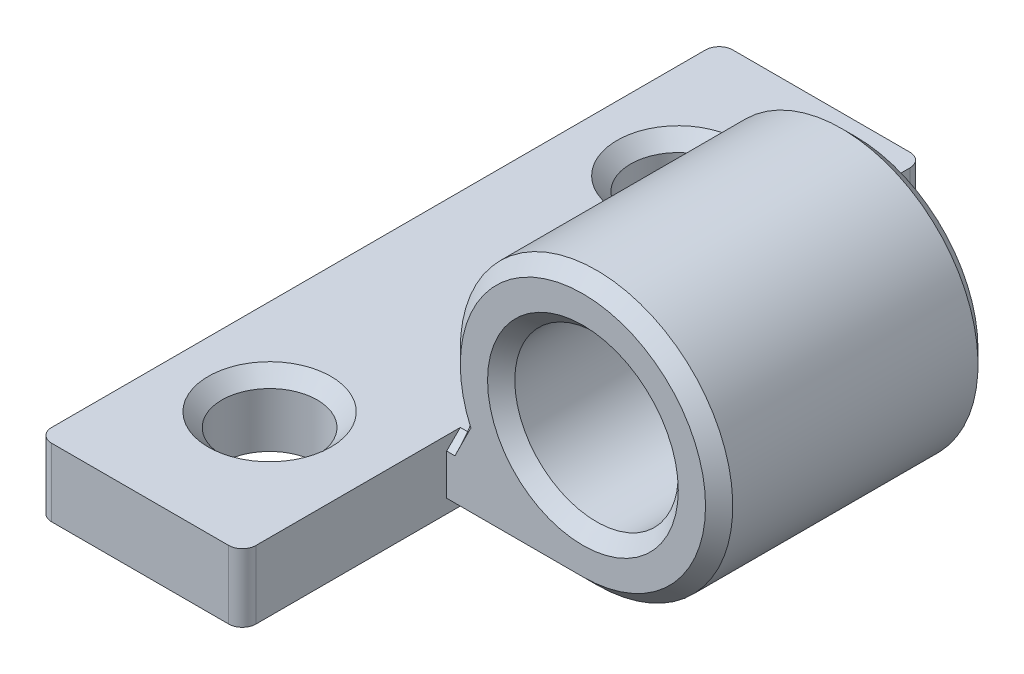
ISO-10303-21;
HEADER;
FILE_DESCRIPTION(('STEP AP214'),'2;1');
FILE_NAME('part.step','',(''),(''),'','','');
FILE_SCHEMA(('AUTOMOTIVE_DESIGN { 1 0 10303 214 1 1 1 1 }'));
ENDSEC;
DATA;
#1=APPLICATION_CONTEXT('core data for automotive mechanical design processes');
#2=APPLICATION_PROTOCOL_DEFINITION('international standard','automotive_design',2000,#1);
#3=PRODUCT_CONTEXT('',#1,'mechanical');
#4=PRODUCT('Part','Part','',(#3));
#5=PRODUCT_RELATED_PRODUCT_CATEGORY('part','',(#4));
#6=PRODUCT_DEFINITION_FORMATION('','',#4);
#7=PRODUCT_DEFINITION_CONTEXT('part definition',#1,'design');
#8=PRODUCT_DEFINITION('design','',#6,#7);
#9=PRODUCT_DEFINITION_SHAPE('','',#8);
#10=(LENGTH_UNIT() NAMED_UNIT(*) SI_UNIT(.MILLI.,.METRE.));
#11=(NAMED_UNIT(*) PLANE_ANGLE_UNIT() SI_UNIT($,.RADIAN.));
#12=(NAMED_UNIT(*) SI_UNIT($,.STERADIAN.) SOLID_ANGLE_UNIT());
#13=UNCERTAINTY_MEASURE_WITH_UNIT(LENGTH_MEASURE(1.E-05),#10,'distance_accuracy_value','');
#14=(GEOMETRIC_REPRESENTATION_CONTEXT(3) GLOBAL_UNCERTAINTY_ASSIGNED_CONTEXT((#13)) GLOBAL_UNIT_ASSIGNED_CONTEXT((#10,
#11,#12)) REPRESENTATION_CONTEXT('',''));
#15=CARTESIAN_POINT('',(0.,0.,0.));
#16=DIRECTION('',(0.,0.,1.));
#17=DIRECTION('',(1.,0.,0.));
#18=AXIS2_PLACEMENT_3D('',#15,#16,#17);
#19=CARTESIAN_POINT('',(-4.65512218419229,-5.89025206734602,34.375));
#20=DIRECTION('',(0.,0.,-1.));
#21=DIRECTION('',(-1.,0.,0.));
#22=AXIS2_PLACEMENT_3D('',#19,#20,#21);
#23=CYLINDRICAL_SURFACE('',#22,3.75);
#24=DIRECTION('',(0.,0.,-1.));
#25=VECTOR('',#24,1.);
#26=CARTESIAN_POINT('',(-4.65512218419229,-9.64025206734602,34.375));
#27=LINE('',#26,#25);
#28=CARTESIAN_POINT('',(-4.65512218419229,-9.64025206734602,28.375));
#29=VERTEX_POINT('',#28);
#30=CARTESIAN_POINT('',(-4.65512218419229,-9.64025206734602,21.625));
#31=VERTEX_POINT('',#30);
#32=EDGE_CURVE('E336',#29,#31,#27,.T.);
#33=ORIENTED_EDGE('',*,*,#32,.T.);
#34=CARTESIAN_POINT('',(-4.65512218419229,-5.89025206734602,21.625));
#35=DIRECTION('',(0.,0.,1.));
#36=DIRECTION('',(1.,0.,0.));
#37=AXIS2_PLACEMENT_3D('',#34,#35,#36);
#38=CIRCLE('',#37,3.75);
#39=CARTESIAN_POINT('',(-8.0825442577188,-7.41185580350838,21.625));
#40=VERTEX_POINT('',#39);
#41=EDGE_CURVE('E231',#31,#40,#38,.T.);
#42=ORIENTED_EDGE('',*,*,#41,.T.);
#43=DIRECTION('',(0.,0.,-1.));
#44=VECTOR('',#43,1.);
#45=CARTESIAN_POINT('',(-8.0825442577188,-7.41185580350838,34.375));
#46=LINE('',#45,#44);
#47=CARTESIAN_POINT('',(-8.0825442577188,-7.41185580350838,28.375));
#48=VERTEX_POINT('',#47);
#49=EDGE_CURVE('E227',#40,#48,#46,.F.);
#50=ORIENTED_EDGE('',*,*,#49,.T.);
#51=CARTESIAN_POINT('',(-4.65512218419229,-5.89025206734602,28.375));
#52=DIRECTION('',(0.,0.,-1.));
#53=DIRECTION('',(-1.,0.,0.));
#54=AXIS2_PLACEMENT_3D('',#51,#52,#53);
#55=CIRCLE('',#54,3.75);
#56=EDGE_CURVE('E229',#48,#29,#55,.T.);
#57=ORIENTED_EDGE('',*,*,#56,.T.);
#58=EDGE_LOOP('',(#33,#42,#50,#57));
#59=FACE_BOUND('',#58,.T.);
#60=ADVANCED_FACE('F36',(#59),#23,.T.);
#61=CARTESIAN_POINT('',(-4.65512218419229,-5.89025206734602,34.375));
#62=DIRECTION('',(0.,0.,1.));
#63=DIRECTION('',(1.,0.,0.));
#64=AXIS2_PLACEMENT_3D('',#61,#62,#63);
#65=PLANE('',#64);
#66=DIRECTION('',(-1.,0.,0.));
#67=VECTOR('',#66,1.);
#68=CARTESIAN_POINT('',(-14.0301221841923,-7.76525206734602,34.375));
#69=LINE('',#68,#67);
#70=CARTESIAN_POINT('',(-8.78012218419229,-7.76525206734602,34.375));
#71=VERTEX_POINT('',#70);
#72=CARTESIAN_POINT('',(-13.6551221841923,-7.76525206734602,34.375));
#73=VERTEX_POINT('',#72);
#74=EDGE_CURVE('E342',#71,#73,#69,.T.);
#75=ORIENTED_EDGE('',*,*,#74,.T.);
#76=DIRECTION('',(0.,-1.,0.));
#77=VECTOR('',#76,1.);
#78=CARTESIAN_POINT('',(-13.6551221841923,-9.64025206734602,34.375));
#79=LINE('',#78,#77);
#80=CARTESIAN_POINT('',(-13.6551221841923,-9.64025206734602,34.375));
#81=VERTEX_POINT('',#80);
#82=EDGE_CURVE('E44',#73,#81,#79,.T.);
#83=ORIENTED_EDGE('',*,*,#82,.T.);
#84=DIRECTION('',(1.,0.,0.));
#85=VECTOR('',#84,1.);
#86=CARTESIAN_POINT('',(-4.65512218419229,-9.64025206734602,34.375));
#87=LINE('',#86,#85);
#88=CARTESIAN_POINT('',(-8.78012218419229,-9.64025206734602,34.375));
#89=VERTEX_POINT('',#88);
#90=EDGE_CURVE('E346',#81,#89,#87,.T.);
#91=ORIENTED_EDGE('',*,*,#90,.T.);
#92=DIRECTION('',(0.,1.,0.));
#93=VECTOR('',#92,1.);
#94=CARTESIAN_POINT('',(-8.78012218419229,-7.76525206734601,34.375));
#95=LINE('',#94,#93);
#96=EDGE_CURVE('E510',#89,#71,#95,.T.);
#97=ORIENTED_EDGE('',*,*,#96,.T.);
#98=EDGE_LOOP('',(#75,#83,#91,#97));
#99=FACE_BOUND('',#98,.T.);
#100=ADVANCED_FACE('F281',(#99),#65,.T.);
#101=CARTESIAN_POINT('',(-4.65512218419229,-5.89025206734602,15.625));
#102=DIRECTION('',(0.,0.,1.));
#103=DIRECTION('',(1.,0.,0.));
#104=AXIS2_PLACEMENT_3D('',#101,#102,#103);
#105=PLANE('',#104);
#106=DIRECTION('',(-1.,0.,0.));
#107=VECTOR('',#106,1.);
#108=CARTESIAN_POINT('',(-14.0301221841923,-7.76525206734602,15.625));
#109=LINE('',#108,#107);
#110=CARTESIAN_POINT('',(-8.78012218419229,-7.76525206734602,15.625));
#111=VERTEX_POINT('',#110);
#112=CARTESIAN_POINT('',(-13.6551221841923,-7.76525206734602,15.625));
#113=VERTEX_POINT('',#112);
#114=EDGE_CURVE('E343',#111,#113,#109,.T.);
#115=ORIENTED_EDGE('',*,*,#114,.F.);
#116=DIRECTION('',(0.,1.,0.));
#117=VECTOR('',#116,1.);
#118=CARTESIAN_POINT('',(-8.78012218419229,-5.89025206734602,15.625));
#119=LINE('',#118,#117);
#120=CARTESIAN_POINT('',(-8.78012218419229,-9.64025206734602,15.625));
#121=VERTEX_POINT('',#120);
#122=EDGE_CURVE('E499',#111,#121,#119,.F.);
#123=ORIENTED_EDGE('',*,*,#122,.T.);
#124=DIRECTION('',(1.,0.,0.));
#125=VECTOR('',#124,1.);
#126=CARTESIAN_POINT('',(-4.65512218419229,-9.64025206734602,15.625));
#127=LINE('',#126,#125);
#128=CARTESIAN_POINT('',(-13.6551221841923,-9.64025206734602,15.625));
#129=VERTEX_POINT('',#128);
#130=EDGE_CURVE('E347',#129,#121,#127,.T.);
#131=ORIENTED_EDGE('',*,*,#130,.F.);
#132=DIRECTION('',(0.,-1.,0.));
#133=VECTOR('',#132,1.);
#134=CARTESIAN_POINT('',(-13.6551221841923,-5.89025206734602,15.625));
#135=LINE('',#134,#133);
#136=EDGE_CURVE('E497',#129,#113,#135,.F.);
#137=ORIENTED_EDGE('',*,*,#136,.T.);
#138=EDGE_LOOP('',(#115,#123,#131,#137));
#139=FACE_BOUND('',#138,.T.);
#140=ADVANCED_FACE('F284',(#139),#105,.F.);
#141=CARTESIAN_POINT('',(-14.0301221841923,-7.76525206734602,34.375));
#142=DIRECTION('',(1.,0.,0.));
#143=DIRECTION('',(0.,1.,0.));
#144=AXIS2_PLACEMENT_3D('',#141,#142,#143);
#145=PLANE('',#144);
#146=DIRECTION('',(0.,0.,-1.));
#147=VECTOR('',#146,1.);
#148=CARTESIAN_POINT('',(-14.0301221841923,-7.76525206734602,34.375));
#149=LINE('',#148,#147);
#150=CARTESIAN_POINT('',(-14.0301221841923,-7.76525206734602,34.));
#151=VERTEX_POINT('',#150);
#152=CARTESIAN_POINT('',(-14.0301221841923,-7.76525206734602,16.));
#153=VERTEX_POINT('',#152);
#154=EDGE_CURVE('E339',#151,#153,#149,.T.);
#155=ORIENTED_EDGE('',*,*,#154,.T.);
#156=DIRECTION('',(0.,-1.,0.));
#157=VECTOR('',#156,1.);
#158=CARTESIAN_POINT('',(-14.0301221841923,-7.76525206734602,16.));
#159=LINE('',#158,#157);
#160=CARTESIAN_POINT('',(-14.0301221841923,-9.64025206734602,16.));
#161=VERTEX_POINT('',#160);
#162=EDGE_CURVE('E508',#153,#161,#159,.T.);
#163=ORIENTED_EDGE('',*,*,#162,.T.);
#164=DIRECTION('',(0.,0.,-1.));
#165=VECTOR('',#164,1.);
#166=CARTESIAN_POINT('',(-14.0301221841923,-9.64025206734602,34.375));
#167=LINE('',#166,#165);
#168=CARTESIAN_POINT('',(-14.0301221841923,-9.64025206734602,34.));
#169=VERTEX_POINT('',#168);
#170=EDGE_CURVE('E334',#169,#161,#167,.T.);
#171=ORIENTED_EDGE('',*,*,#170,.F.);
#172=DIRECTION('',(0.,-1.,0.));
#173=VECTOR('',#172,1.);
#174=CARTESIAN_POINT('',(-14.0301221841923,-7.76525206734602,34.));
#175=LINE('',#174,#173);
#176=EDGE_CURVE('E483',#169,#151,#175,.F.);
#177=ORIENTED_EDGE('',*,*,#176,.T.);
#178=EDGE_LOOP('',(#155,#163,#171,#177));
#179=FACE_BOUND('',#178,.T.);
#180=ADVANCED_FACE('F288',(#179),#145,.F.);
#181=CARTESIAN_POINT('',(-4.65512218419229,-9.64025206734602,34.375));
#182=DIRECTION('',(0.,1.,0.));
#183=DIRECTION('',(-1.,0.,0.));
#184=AXIS2_PLACEMENT_3D('',#181,#182,#183);
#185=PLANE('',#184);
#186=CARTESIAN_POINT('',(-11.4051221841923,-9.64025206734602,19.375));
#187=DIRECTION('',(0.,1.,0.));
#188=DIRECTION('',(-1.,0.,0.));
#189=AXIS2_PLACEMENT_3D('',#186,#187,#188);
#190=CIRCLE('',#189,1.3125);
#191=CARTESIAN_POINT('',(-12.7176221841923,-9.64025206734602,19.375));
#192=VERTEX_POINT('',#191);
#193=EDGE_CURVE('E350',#192,#192,#190,.T.);
#194=ORIENTED_EDGE('',*,*,#193,.T.);
#195=EDGE_LOOP('',(#194));
#196=FACE_BOUND('',#195,.T.);
#197=CARTESIAN_POINT('',(-11.4051221841923,-9.64025206734602,30.625));
#198=DIRECTION('',(0.,1.,0.));
#199=DIRECTION('',(-1.,0.,0.));
#200=AXIS2_PLACEMENT_3D('',#197,#198,#199);
#201=CIRCLE('',#200,1.3125);
#202=CARTESIAN_POINT('',(-12.7176221841923,-9.64025206734602,30.625));
#203=VERTEX_POINT('',#202);
#204=EDGE_CURVE('E357',#203,#203,#201,.T.);
#205=ORIENTED_EDGE('',*,*,#204,.T.);
#206=EDGE_LOOP('',(#205));
#207=FACE_BOUND('',#206,.T.);
#208=ORIENTED_EDGE('',*,*,#130,.T.);
#209=CARTESIAN_POINT('',(-8.78012218419229,-9.64025206734602,16.));
#210=DIRECTION('',(0.,1.,0.));
#211=DIRECTION('',(-1.,0.,0.));
#212=AXIS2_PLACEMENT_3D('',#209,#210,#211);
#213=CIRCLE('',#212,0.375);
#214=CARTESIAN_POINT('',(-8.40512218419229,-9.64025206734602,16.));
#215=VERTEX_POINT('',#214);
#216=EDGE_CURVE('E505',#121,#215,#213,.F.);
#217=ORIENTED_EDGE('',*,*,#216,.T.);
#218=DIRECTION('',(0.,0.,1.));
#219=VECTOR('',#218,1.);
#220=CARTESIAN_POINT('',(-8.40512218419229,-9.64025206734602,34.375));
#221=LINE('',#220,#219);
#222=CARTESIAN_POINT('',(-8.40512218419229,-9.64025206734602,21.625));
#223=VERTEX_POINT('',#222);
#224=EDGE_CURVE('E360',#215,#223,#221,.T.);
#225=ORIENTED_EDGE('',*,*,#224,.T.);
#226=DIRECTION('',(1.,0.,0.));
#227=VECTOR('',#226,1.);
#228=CARTESIAN_POINT('',(-4.65512218419229,-9.64025206734602,21.625));
#229=LINE('',#228,#227);
#230=EDGE_CURVE('E217',#223,#31,#229,.T.);
#231=ORIENTED_EDGE('',*,*,#230,.T.);
#232=ORIENTED_EDGE('',*,*,#32,.F.);
#233=DIRECTION('',(-1.,0.,0.));
#234=VECTOR('',#233,1.);
#235=CARTESIAN_POINT('',(-4.65512218419229,-9.64025206734602,28.375));
#236=LINE('',#235,#234);
#237=CARTESIAN_POINT('',(-8.40512218419229,-9.64025206734602,28.375));
#238=VERTEX_POINT('',#237);
#239=EDGE_CURVE('E215',#29,#238,#236,.T.);
#240=ORIENTED_EDGE('',*,*,#239,.T.);
#241=DIRECTION('',(0.,0.,1.));
#242=VECTOR('',#241,1.);
#243=CARTESIAN_POINT('',(-8.40512218419229,-9.64025206734602,34.375));
#244=LINE('',#243,#242);
#245=CARTESIAN_POINT('',(-8.40512218419229,-9.64025206734602,34.));
#246=VERTEX_POINT('',#245);
#247=EDGE_CURVE('E170',#238,#246,#244,.T.);
#248=ORIENTED_EDGE('',*,*,#247,.T.);
#249=CARTESIAN_POINT('',(-8.78012218419229,-9.64025206734602,34.));
#250=DIRECTION('',(0.,1.,0.));
#251=DIRECTION('',(-1.,0.,0.));
#252=AXIS2_PLACEMENT_3D('',#249,#250,#251);
#253=CIRCLE('',#252,0.375);
#254=EDGE_CURVE('E501',#246,#89,#253,.F.);
#255=ORIENTED_EDGE('',*,*,#254,.T.);
#256=ORIENTED_EDGE('',*,*,#90,.F.);
#257=CARTESIAN_POINT('',(-13.6551221841923,-9.64025206734602,34.));
#258=DIRECTION('',(0.,1.,0.));
#259=DIRECTION('',(-1.,0.,0.));
#260=AXIS2_PLACEMENT_3D('',#257,#258,#259);
#261=CIRCLE('',#260,0.375);
#262=EDGE_CURVE('E59',#81,#169,#261,.F.);
#263=ORIENTED_EDGE('',*,*,#262,.T.);
#264=ORIENTED_EDGE('',*,*,#170,.T.);
#265=CARTESIAN_POINT('',(-13.6551221841923,-9.64025206734602,16.));
#266=DIRECTION('',(0.,1.,0.));
#267=DIRECTION('',(-1.,0.,0.));
#268=AXIS2_PLACEMENT_3D('',#265,#266,#267);
#269=CIRCLE('',#268,0.375);
#270=EDGE_CURVE('E51',#161,#129,#269,.F.);
#271=ORIENTED_EDGE('',*,*,#270,.T.);
#272=EDGE_LOOP('',(#208,#217,#225,#231,#232,#240,#248,#255,#256,#263,#264,#271));
#273=FACE_BOUND('',#272,.T.);
#274=ADVANCED_FACE('F292',(#196,#207,#273),#185,.F.);
#275=CARTESIAN_POINT('',(-14.0301221841923,-7.76525206734602,34.375));
#276=DIRECTION('',(0.,-1.,0.));
#277=DIRECTION('',(1.,0.,0.));
#278=AXIS2_PLACEMENT_3D('',#275,#276,#277);
#279=PLANE('',#278);
#280=CARTESIAN_POINT('',(-11.4051221841923,-7.76525206734602,30.625));
#281=DIRECTION('',(0.,-1.,0.));
#282=DIRECTION('',(1.,0.,0.));
#283=AXIS2_PLACEMENT_3D('',#280,#281,#282);
#284=CIRCLE('',#283,1.68749999999999);
#285=CARTESIAN_POINT('',(-9.71762218419231,-7.76525206734602,30.625));
#286=VERTEX_POINT('',#285);
#287=EDGE_CURVE('E321',#286,#286,#284,.T.);
#288=ORIENTED_EDGE('',*,*,#287,.T.);
#289=EDGE_LOOP('',(#288));
#290=FACE_BOUND('',#289,.T.);
#291=CARTESIAN_POINT('',(-11.4051221841923,-7.76525206734602,19.375));
#292=DIRECTION('',(0.,-1.,0.));
#293=DIRECTION('',(1.,0.,0.));
#294=AXIS2_PLACEMENT_3D('',#291,#292,#293);
#295=CIRCLE('',#294,1.6875);
#296=CARTESIAN_POINT('',(-9.7176221841923,-7.76525206734602,19.375));
#297=VERTEX_POINT('',#296);
#298=EDGE_CURVE('E318',#297,#297,#295,.T.);
#299=ORIENTED_EDGE('',*,*,#298,.T.);
#300=EDGE_LOOP('',(#299));
#301=FACE_BOUND('',#300,.T.);
#302=DIRECTION('',(0.,0.,-1.));
#303=VECTOR('',#302,1.);
#304=CARTESIAN_POINT('',(-8.40512218419229,-7.76525206734602,34.375));
#305=LINE('',#304,#303);
#306=CARTESIAN_POINT('',(-8.40512218419229,-7.76525206734602,21.625));
#307=VERTEX_POINT('',#306);
#308=CARTESIAN_POINT('',(-8.40512218419229,-7.76525206734602,16.));
#309=VERTEX_POINT('',#308);
#310=EDGE_CURVE('E329',#307,#309,#305,.T.);
#311=ORIENTED_EDGE('',*,*,#310,.T.);
#312=CARTESIAN_POINT('',(-8.78012218419229,-7.76525206734601,16.));
#313=DIRECTION('',(0.,-1.,0.));
#314=DIRECTION('',(1.,0.,0.));
#315=AXIS2_PLACEMENT_3D('',#312,#313,#314);
#316=CIRCLE('',#315,0.375);
#317=EDGE_CURVE('E491',#309,#111,#316,.F.);
#318=ORIENTED_EDGE('',*,*,#317,.T.);
#319=ORIENTED_EDGE('',*,*,#114,.T.);
#320=CARTESIAN_POINT('',(-13.6551221841923,-7.76525206734602,16.));
#321=DIRECTION('',(0.,-1.,0.));
#322=DIRECTION('',(1.,0.,0.));
#323=AXIS2_PLACEMENT_3D('',#320,#321,#322);
#324=CIRCLE('',#323,0.375);
#325=EDGE_CURVE('E488',#113,#153,#324,.F.);
#326=ORIENTED_EDGE('',*,*,#325,.T.);
#327=ORIENTED_EDGE('',*,*,#154,.F.);
#328=CARTESIAN_POINT('',(-13.6551221841923,-7.76525206734602,34.));
#329=DIRECTION('',(0.,-1.,0.));
#330=DIRECTION('',(1.,0.,0.));
#331=AXIS2_PLACEMENT_3D('',#328,#329,#330);
#332=CIRCLE('',#331,0.375);
#333=EDGE_CURVE('E482',#151,#73,#332,.F.);
#334=ORIENTED_EDGE('',*,*,#333,.T.);
#335=ORIENTED_EDGE('',*,*,#74,.F.);
#336=CARTESIAN_POINT('',(-8.78012218419229,-7.76525206734602,34.));
#337=DIRECTION('',(0.,-1.,0.));
#338=DIRECTION('',(1.,0.,0.));
#339=AXIS2_PLACEMENT_3D('',#336,#337,#338);
#340=CIRCLE('',#339,0.375);
#341=CARTESIAN_POINT('',(-8.40512218419229,-7.76525206734602,34.));
#342=VERTEX_POINT('',#341);
#343=EDGE_CURVE('E489',#71,#342,#340,.F.);
#344=ORIENTED_EDGE('',*,*,#343,.T.);
#345=DIRECTION('',(0.,0.,-1.));
#346=VECTOR('',#345,1.);
#347=CARTESIAN_POINT('',(-8.40512218419229,-7.76525206734602,34.375));
#348=LINE('',#347,#346);
#349=CARTESIAN_POINT('',(-8.40512218419229,-7.76525206734602,28.375));
#350=VERTEX_POINT('',#349);
#351=EDGE_CURVE('E332',#342,#350,#348,.T.);
#352=ORIENTED_EDGE('',*,*,#351,.T.);
#353=DIRECTION('',(1.,0.,0.));
#354=VECTOR('',#353,1.);
#355=CARTESIAN_POINT('',(-14.0301221841923,-7.76525206734602,28.375));
#356=LINE('',#355,#354);
#357=CARTESIAN_POINT('',(-8.17723650122227,-7.76525206734602,28.375));
#358=VERTEX_POINT('',#357);
#359=EDGE_CURVE('E222',#350,#358,#356,.T.);
#360=ORIENTED_EDGE('',*,*,#359,.T.);
#361=DIRECTION('',(0.,0.,-1.));
#362=VECTOR('',#361,1.);
#363=CARTESIAN_POINT('',(-8.17723650122227,-7.76525206734602,21.25));
#364=LINE('',#363,#362);
#365=CARTESIAN_POINT('',(-8.17723650122227,-7.76525206734602,21.625));
#366=VERTEX_POINT('',#365);
#367=EDGE_CURVE('E220',#358,#366,#364,.T.);
#368=ORIENTED_EDGE('',*,*,#367,.T.);
#369=DIRECTION('',(-1.,0.,0.));
#370=VECTOR('',#369,1.);
#371=CARTESIAN_POINT('',(-14.0301221841923,-7.76525206734602,21.625));
#372=LINE('',#371,#370);
#373=EDGE_CURVE('E224',#366,#307,#372,.T.);
#374=ORIENTED_EDGE('',*,*,#373,.T.);
#375=EDGE_LOOP('',(#311,#318,#319,#326,#327,#334,#335,#344,#352,#360,#368,#374));
#376=FACE_BOUND('',#375,.T.);
#377=ADVANCED_FACE('F275',(#290,#301,#376),#279,.F.);
#378=CARTESIAN_POINT('',(-11.4051221841923,-11.515252067346,30.625));
#379=DIRECTION('',(0.,1.,0.));
#380=DIRECTION('',(-1.,0.,0.));
#381=AXIS2_PLACEMENT_3D('',#378,#379,#380);
#382=CYLINDRICAL_SURFACE('',#381,1.3125);
#383=CARTESIAN_POINT('',(-11.4051221841923,-8.14025206734601,30.625));
#384=DIRECTION('',(0.,-1.,0.));
#385=DIRECTION('',(0.,0.,-1.));
#386=AXIS2_PLACEMENT_3D('',#383,#384,#385);
#387=CIRCLE('',#386,1.3125);
#388=CARTESIAN_POINT('',(-11.4051221841923,-8.14025206734601,29.3125));
#389=VERTEX_POINT('',#388);
#390=EDGE_CURVE('E326',#389,#389,#387,.F.);
#391=ORIENTED_EDGE('',*,*,#390,.T.);
#392=EDGE_LOOP('',(#391));
#393=FACE_BOUND('',#392,.T.);
#394=ORIENTED_EDGE('',*,*,#204,.F.);
#395=EDGE_LOOP('',(#394));
#396=FACE_BOUND('',#395,.T.);
#397=ADVANCED_FACE('F271',(#393,#396),#382,.F.);
#398=CARTESIAN_POINT('',(-11.4051221841923,-11.515252067346,19.375));
#399=DIRECTION('',(0.,1.,0.));
#400=DIRECTION('',(-1.,0.,0.));
#401=AXIS2_PLACEMENT_3D('',#398,#399,#400);
#402=CYLINDRICAL_SURFACE('',#401,1.3125);
#403=CARTESIAN_POINT('',(-11.4051221841923,-8.14025206734602,19.375));
#404=DIRECTION('',(0.,-1.,0.));
#405=DIRECTION('',(0.,0.,-1.));
#406=AXIS2_PLACEMENT_3D('',#403,#404,#405);
#407=CIRCLE('',#406,1.3125);
#408=CARTESIAN_POINT('',(-11.4051221841923,-8.14025206734602,18.0625));
#409=VERTEX_POINT('',#408);
#410=EDGE_CURVE('E194',#409,#409,#407,.F.);
#411=ORIENTED_EDGE('',*,*,#410,.T.);
#412=EDGE_LOOP('',(#411));
#413=FACE_BOUND('',#412,.T.);
#414=ORIENTED_EDGE('',*,*,#193,.F.);
#415=EDGE_LOOP('',(#414));
#416=FACE_BOUND('',#415,.T.);
#417=ADVANCED_FACE('F264',(#413,#416),#402,.F.);
#418=CARTESIAN_POINT('',(-8.40512218419229,-15.265252067346,34.375));
#419=DIRECTION('',(-1.,0.,0.));
#420=DIRECTION('',(0.,-1.,0.));
#421=AXIS2_PLACEMENT_3D('',#418,#419,#420);
#422=PLANE('',#421);
#423=ORIENTED_EDGE('',*,*,#351,.F.);
#424=DIRECTION('',(0.,1.,0.));
#425=VECTOR('',#424,1.);
#426=CARTESIAN_POINT('',(-8.40512218419229,-9.64025206734602,34.));
#427=LINE('',#426,#425);
#428=EDGE_CURVE('E11',#342,#246,#427,.F.);
#429=ORIENTED_EDGE('',*,*,#428,.T.);
#430=ORIENTED_EDGE('',*,*,#247,.F.);
#431=DIRECTION('',(0.,-0.707106781186553,-0.707106781186542));
#432=VECTOR('',#431,1.);
#433=CARTESIAN_POINT('',(-8.40512218419229,-9.45275206734606,28.5625));
#434=LINE('',#433,#432);
#435=CARTESIAN_POINT('',(-8.40512218419229,-9.26525206734601,28.75));
#436=VERTEX_POINT('',#435);
#437=EDGE_CURVE('E162',#238,#436,#434,.F.);
#438=ORIENTED_EDGE('',*,*,#437,.T.);
#439=DIRECTION('',(0.,1.,0.));
#440=VECTOR('',#439,1.);
#441=CARTESIAN_POINT('',(-8.40512218419229,-15.265252067346,28.75));
#442=LINE('',#441,#440);
#443=CARTESIAN_POINT('',(-8.40512218419229,-8.14025206734602,28.75));
#444=VERTEX_POINT('',#443);
#445=EDGE_CURVE('E167',#436,#444,#442,.T.);
#446=ORIENTED_EDGE('',*,*,#445,.T.);
#447=DIRECTION('',(0.,-0.707106781186552,0.707106781186543));
#448=VECTOR('',#447,1.);
#449=CARTESIAN_POINT('',(-8.40512218419229,-14.5152520673461,35.125));
#450=LINE('',#449,#448);
#451=EDGE_CURVE('E176',#444,#350,#450,.F.);
#452=ORIENTED_EDGE('',*,*,#451,.T.);
#453=EDGE_LOOP('',(#423,#429,#430,#438,#446,#452));
#454=FACE_BOUND('',#453,.T.);
#455=ADVANCED_FACE('F165',(#454),#422,.F.);
#456=CARTESIAN_POINT('',(-0.90512218419229,-15.265252067346,28.75));
#457=DIRECTION('',(0.,0.,-1.));
#458=DIRECTION('',(-1.,0.,0.));
#459=AXIS2_PLACEMENT_3D('',#456,#457,#458);
#460=PLANE('',#459);
#461=CARTESIAN_POINT('',(-4.65512218419229,-5.89025206734602,28.75));
#462=DIRECTION('',(0.,0.,-1.));
#463=DIRECTION('',(-1.,0.,0.));
#464=AXIS2_PLACEMENT_3D('',#461,#462,#463);
#465=CIRCLE('',#464,2.625);
#466=CARTESIAN_POINT('',(-7.28012218419229,-5.89025206734602,28.75));
#467=VERTEX_POINT('',#466);
#468=EDGE_CURVE('E192',#467,#467,#465,.T.);
#469=ORIENTED_EDGE('',*,*,#468,.T.);
#470=EDGE_LOOP('',(#469));
#471=FACE_BOUND('',#470,.T.);
#472=CARTESIAN_POINT('',(-4.65512218419229,-5.89025206734602,28.75));
#473=DIRECTION('',(0.,0.,-1.));
#474=DIRECTION('',(-1.,0.,0.));
#475=AXIS2_PLACEMENT_3D('',#472,#473,#474);
#476=CIRCLE('',#475,3.37499999999999);
#477=CARTESIAN_POINT('',(-4.65512218419229,-9.26525206734601,28.75));
#478=VERTEX_POINT('',#477);
#479=CARTESIAN_POINT('',(-7.73980205036614,-7.25969542989214,28.75));
#480=VERTEX_POINT('',#479);
#481=EDGE_CURVE('E190',#478,#480,#476,.F.);
#482=ORIENTED_EDGE('',*,*,#481,.T.);
#483=CARTESIAN_POINT('',(-8.17723650122227,-8.14025206734602,28.75));
#484=CARTESIAN_POINT('',(-8.13791268570665,-8.06109312891647,28.75));
#485=CARTESIAN_POINT('',(-8.09858887019104,-7.98193419048691,28.75));
#486=CARTESIAN_POINT('',(-8.01994123915981,-7.8236163136278,28.75));
#487=CARTESIAN_POINT('',(-7.98061742364419,-7.74445737519825,28.75));
#488=CARTESIAN_POINT('',(-7.8741297555411,-7.53009743447651,28.75));
#489=CARTESIAN_POINT('',(-7.80696590295362,-7.39489643218432,28.75));
#490=CARTESIAN_POINT('',(-7.73980205036614,-7.25969542989214,28.75));
#491=B_SPLINE_CURVE_WITH_KNOTS('',3,(#483,#484,#485,#486,#487,#488,#489,#490),.UNSPECIFIED.,.F.,
.F.,(4,2,2,4),(0.,0.26516504294496,0.530330085889919,0.983223723554253),.UNSPECIFIED.);
#492=CARTESIAN_POINT('',(-8.17723650122227,-8.14025206734602,28.75));
#493=VERTEX_POINT('',#492);
#494=EDGE_CURVE('E241',#480,#493,#491,.F.);
#495=ORIENTED_EDGE('',*,*,#494,.T.);
#496=DIRECTION('',(-1.,0.,0.));
#497=VECTOR('',#496,1.);
#498=CARTESIAN_POINT('',(-0.905122184192294,-8.14025206734602,28.75));
#499=LINE('',#498,#497);
#500=EDGE_CURVE('E183',#493,#444,#499,.T.);
#501=ORIENTED_EDGE('',*,*,#500,.T.);
#502=ORIENTED_EDGE('',*,*,#445,.F.);
#503=DIRECTION('',(1.,0.,0.));
#504=VECTOR('',#503,1.);
#505=CARTESIAN_POINT('',(-0.905122184192292,-9.265252067346,28.75));
#506=LINE('',#505,#504);
#507=EDGE_CURVE('E180',#436,#478,#506,.T.);
#508=ORIENTED_EDGE('',*,*,#507,.T.);
#509=EDGE_LOOP('',(#482,#495,#501,#502,#508));
#510=FACE_BOUND('',#509,.T.);
#511=ADVANCED_FACE('F179',(#471,#510),#460,.F.);
#512=CARTESIAN_POINT('',(-8.40512218419229,-15.265252067346,21.25));
#513=DIRECTION('',(-1.,0.,0.));
#514=DIRECTION('',(0.,-1.,0.));
#515=AXIS2_PLACEMENT_3D('',#512,#513,#514);
#516=PLANE('',#515);
#517=ORIENTED_EDGE('',*,*,#224,.F.);
#518=DIRECTION('',(0.,1.,0.));
#519=VECTOR('',#518,1.);
#520=CARTESIAN_POINT('',(-8.40512218419229,-15.265252067346,16.));
#521=LINE('',#520,#519);
#522=EDGE_CURVE('E175',#215,#309,#521,.T.);
#523=ORIENTED_EDGE('',*,*,#522,.T.);
#524=ORIENTED_EDGE('',*,*,#310,.F.);
#525=DIRECTION('',(0.,0.70710678118655,0.707106781186545));
#526=VECTOR('',#525,1.);
#527=CARTESIAN_POINT('',(-8.40512218419229,-11.702752067346,17.6875));
#528=LINE('',#527,#526);
#529=CARTESIAN_POINT('',(-8.40512218419229,-8.14025206734602,21.25));
#530=VERTEX_POINT('',#529);
#531=EDGE_CURVE('E375',#307,#530,#528,.F.);
#532=ORIENTED_EDGE('',*,*,#531,.T.);
#533=DIRECTION('',(0.,1.,0.));
#534=VECTOR('',#533,1.);
#535=CARTESIAN_POINT('',(-8.40512218419229,-15.265252067346,21.25));
#536=LINE('',#535,#534);
#537=CARTESIAN_POINT('',(-8.40512218419229,-9.26525206734602,21.25));
#538=VERTEX_POINT('',#537);
#539=EDGE_CURVE('E184',#538,#530,#536,.T.);
#540=ORIENTED_EDGE('',*,*,#539,.F.);
#541=DIRECTION('',(0.,0.707106781186548,-0.707106781186547));
#542=VECTOR('',#541,1.);
#543=CARTESIAN_POINT('',(-8.40512218419229,-12.265252067346,24.25));
#544=LINE('',#543,#542);
#545=EDGE_CURVE('E396',#538,#223,#544,.F.);
#546=ORIENTED_EDGE('',*,*,#545,.T.);
#547=EDGE_LOOP('',(#517,#523,#524,#532,#540,#546));
#548=FACE_BOUND('',#547,.T.);
#549=ADVANCED_FACE('F258',(#548),#516,.F.);
#550=CARTESIAN_POINT('',(-8.40512218419229,-15.265252067346,21.25));
#551=DIRECTION('',(0.,0.,1.));
#552=DIRECTION('',(1.,0.,0.));
#553=AXIS2_PLACEMENT_3D('',#550,#551,#552);
#554=PLANE('',#553);
#555=CARTESIAN_POINT('',(-4.65512218419229,-5.89025206734602,21.25));
#556=DIRECTION('',(0.,0.,1.));
#557=DIRECTION('',(1.,0.,0.));
#558=AXIS2_PLACEMENT_3D('',#555,#556,#557);
#559=CIRCLE('',#558,2.62499999999999);
#560=CARTESIAN_POINT('',(-2.0301221841923,-5.89025206734602,21.25));
#561=VERTEX_POINT('',#560);
#562=EDGE_CURVE('E212',#561,#561,#559,.T.);
#563=ORIENTED_EDGE('',*,*,#562,.T.);
#564=EDGE_LOOP('',(#563));
#565=FACE_BOUND('',#564,.T.);
#566=DIRECTION('',(1.,0.,0.));
#567=VECTOR('',#566,1.);
#568=CARTESIAN_POINT('',(-8.40512218419229,-8.14025206734602,21.25));
#569=LINE('',#568,#567);
#570=CARTESIAN_POINT('',(-8.17723650122227,-8.14025206734602,21.25));
#571=VERTEX_POINT('',#570);
#572=EDGE_CURVE('E210',#530,#571,#569,.T.);
#573=ORIENTED_EDGE('',*,*,#572,.T.);
#574=CARTESIAN_POINT('',(-7.73980205036615,-7.25969542989214,21.25));
#575=CARTESIAN_POINT('',(-7.77912586588176,-7.3388543683217,21.25));
#576=CARTESIAN_POINT('',(-7.81844968139738,-7.41801330675125,21.25));
#577=CARTESIAN_POINT('',(-7.8970973124286,-7.57633118361036,21.25));
#578=CARTESIAN_POINT('',(-7.93642112794422,-7.65549012203992,21.25));
#579=CARTESIAN_POINT('',(-8.04290879604731,-7.86985006276165,21.25));
#580=CARTESIAN_POINT('',(-8.11007264863479,-8.00505106505383,21.25));
#581=CARTESIAN_POINT('',(-8.17723650122227,-8.14025206734602,21.25));
#582=B_SPLINE_CURVE_WITH_KNOTS('',3,(#574,#575,#576,#577,#578,#579,#580,#581),.UNSPECIFIED.,.F.,
.F.,(4,2,2,4),(0.,0.265165042944955,0.53033008588991,0.98322372355424),.UNSPECIFIED.);
#583=CARTESIAN_POINT('',(-7.73980205036615,-7.25969542989214,21.25));
#584=VERTEX_POINT('',#583);
#585=EDGE_CURVE('E233',#571,#584,#582,.F.);
#586=ORIENTED_EDGE('',*,*,#585,.T.);
#587=CARTESIAN_POINT('',(-4.65512218419229,-5.89025206734602,21.25));
#588=DIRECTION('',(0.,0.,1.));
#589=DIRECTION('',(1.,0.,0.));
#590=AXIS2_PLACEMENT_3D('',#587,#588,#589);
#591=CIRCLE('',#590,3.375);
#592=CARTESIAN_POINT('',(-4.65512218419229,-9.26525206734602,21.25));
#593=VERTEX_POINT('',#592);
#594=EDGE_CURVE('E206',#584,#593,#591,.F.);
#595=ORIENTED_EDGE('',*,*,#594,.T.);
#596=DIRECTION('',(-1.,0.,0.));
#597=VECTOR('',#596,1.);
#598=CARTESIAN_POINT('',(-8.40512218419229,-9.26525206734602,21.25));
#599=LINE('',#598,#597);
#600=EDGE_CURVE('E208',#593,#538,#599,.T.);
#601=ORIENTED_EDGE('',*,*,#600,.T.);
#602=ORIENTED_EDGE('',*,*,#539,.T.);
#603=EDGE_LOOP('',(#573,#586,#595,#601,#602));
#604=FACE_BOUND('',#603,.T.);
#605=ADVANCED_FACE('F253',(#565,#604),#554,.F.);
#606=CARTESIAN_POINT('',(-4.65512218419229,-5.89025206734602,34.375));
#607=DIRECTION('',(0.,0.,-1.));
#608=DIRECTION('',(-1.,0.,0.));
#609=AXIS2_PLACEMENT_3D('',#606,#607,#608);
#610=CYLINDRICAL_SURFACE('',#609,2.25);
#611=CARTESIAN_POINT('',(-4.65512218419229,-5.89025206734602,28.375));
#612=DIRECTION('',(0.,0.,-1.));
#613=DIRECTION('',(-1.,0.,0.));
#614=AXIS2_PLACEMENT_3D('',#611,#612,#613);
#615=CIRCLE('',#614,2.25);
#616=CARTESIAN_POINT('',(-6.90512218419229,-5.89025206734602,28.375));
#617=VERTEX_POINT('',#616);
#618=EDGE_CURVE('E203',#617,#617,#615,.F.);
#619=ORIENTED_EDGE('',*,*,#618,.T.);
#620=EDGE_LOOP('',(#619));
#621=FACE_BOUND('',#620,.T.);
#622=CARTESIAN_POINT('',(-4.65512218419229,-5.89025206734602,21.625));
#623=DIRECTION('',(0.,0.,1.));
#624=DIRECTION('',(1.,0.,0.));
#625=AXIS2_PLACEMENT_3D('',#622,#623,#624);
#626=CIRCLE('',#625,2.25);
#627=CARTESIAN_POINT('',(-2.40512218419229,-5.89025206734602,21.625));
#628=VERTEX_POINT('',#627);
#629=EDGE_CURVE('E200',#628,#628,#626,.F.);
#630=ORIENTED_EDGE('',*,*,#629,.T.);
#631=EDGE_LOOP('',(#630));
#632=FACE_BOUND('',#631,.T.);
#633=ADVANCED_FACE('F257',(#621,#632),#610,.F.);
#634=CARTESIAN_POINT('',(-11.4051221841923,-8.14025206734601,30.625));
#635=DIRECTION('',(0.,1.,0.));
#636=DIRECTION('',(0.,0.,1.));
#637=AXIS2_PLACEMENT_3D('',#634,#635,#636);
#638=CONICAL_SURFACE('',#637,1.3125,0.785398163397445);
#639=ORIENTED_EDGE('',*,*,#287,.F.);
#640=EDGE_LOOP('',(#639));
#641=FACE_BOUND('',#640,.T.);
#642=ORIENTED_EDGE('',*,*,#390,.F.);
#643=EDGE_LOOP('',(#642));
#644=FACE_BOUND('',#643,.T.);
#645=ADVANCED_FACE('F279',(#641,#644),#638,.F.);
#646=CARTESIAN_POINT('',(-11.4051221841923,-8.14025206734602,19.375));
#647=DIRECTION('',(0.,1.,0.));
#648=DIRECTION('',(0.,0.,1.));
#649=AXIS2_PLACEMENT_3D('',#646,#647,#648);
#650=CONICAL_SURFACE('',#649,1.3125,0.785398163397449);
#651=ORIENTED_EDGE('',*,*,#298,.F.);
#652=EDGE_LOOP('',(#651));
#653=FACE_BOUND('',#652,.T.);
#654=ORIENTED_EDGE('',*,*,#410,.F.);
#655=EDGE_LOOP('',(#654));
#656=FACE_BOUND('',#655,.T.);
#657=ADVANCED_FACE('F304',(#653,#656),#650,.F.);
#658=CARTESIAN_POINT('',(-4.65512218419229,-5.89025206734602,28.75));
#659=DIRECTION('',(0.,0.,1.));
#660=DIRECTION('',(1.,0.,0.));
#661=AXIS2_PLACEMENT_3D('',#658,#659,#660);
#662=CONICAL_SURFACE('',#661,2.625,0.785398163397446);
#663=ORIENTED_EDGE('',*,*,#618,.F.);
#664=EDGE_LOOP('',(#663));
#665=FACE_BOUND('',#664,.T.);
#666=ORIENTED_EDGE('',*,*,#468,.F.);
#667=EDGE_LOOP('',(#666));
#668=FACE_BOUND('',#667,.T.);
#669=ADVANCED_FACE('F307',(#665,#668),#662,.F.);
#670=CARTESIAN_POINT('',(-4.65512218419229,-5.89025206734602,21.25));
#671=DIRECTION('',(0.,0.,-1.));
#672=DIRECTION('',(-1.,0.,0.));
#673=AXIS2_PLACEMENT_3D('',#670,#671,#672);
#674=CONICAL_SURFACE('',#673,2.62499999999999,0.785398163397443);
#675=ORIENTED_EDGE('',*,*,#629,.F.);
#676=EDGE_LOOP('',(#675));
#677=FACE_BOUND('',#676,.T.);
#678=ORIENTED_EDGE('',*,*,#562,.F.);
#679=EDGE_LOOP('',(#678));
#680=FACE_BOUND('',#679,.T.);
#681=ADVANCED_FACE('F312',(#677,#680),#674,.F.);
#682=CARTESIAN_POINT('',(-4.65512218419229,-9.64025206734602,28.375));
#683=DIRECTION('',(0.,0.707106781186542,-0.707106781186553));
#684=DIRECTION('',(-1.,0.,0.));
#685=AXIS2_PLACEMENT_3D('',#682,#683,#684);
#686=PLANE('',#685);
#687=ORIENTED_EDGE('',*,*,#437,.F.);
#688=ORIENTED_EDGE('',*,*,#239,.F.);
#689=DIRECTION('',(0.,-0.707106781186553,-0.707106781186542));
#690=VECTOR('',#689,1.);
#691=CARTESIAN_POINT('',(-4.65512218419229,-9.265252067346,28.75));
#692=LINE('',#691,#690);
#693=EDGE_CURVE('E185',#478,#29,#692,.T.);
#694=ORIENTED_EDGE('',*,*,#693,.F.);
#695=ORIENTED_EDGE('',*,*,#507,.F.);
#696=EDGE_LOOP('',(#687,#688,#694,#695));
#697=FACE_BOUND('',#696,.T.);
#698=ADVANCED_FACE('F187',(#697),#686,.F.);
#699=CARTESIAN_POINT('',(-4.65512218419229,-5.89025206734602,28.375));
#700=DIRECTION('',(0.,0.,-1.));
#701=DIRECTION('',(-1.,0.,0.));
#702=AXIS2_PLACEMENT_3D('',#699,#700,#701);
#703=CONICAL_SURFACE('',#702,3.75,0.785398163397453);
#704=ORIENTED_EDGE('',*,*,#693,.T.);
#705=ORIENTED_EDGE('',*,*,#56,.F.);
#706=DIRECTION('',(-0.64628090404775,-0.286916352031786,-0.707106781186544));
#707=VECTOR('',#706,1.);
#708=CARTESIAN_POINT('',(-7.73980205036614,-7.25969542989214,28.75));
#709=LINE('',#708,#707);
#710=EDGE_CURVE('E527',#480,#48,#709,.T.);
#711=ORIENTED_EDGE('',*,*,#710,.F.);
#712=ORIENTED_EDGE('',*,*,#481,.F.);
#713=EDGE_LOOP('',(#704,#705,#711,#712));
#714=FACE_BOUND('',#713,.T.);
#715=ADVANCED_FACE('F459',(#714),#703,.T.);
#716=CARTESIAN_POINT('',(-14.0301221841923,-7.76525206734602,28.375));
#717=DIRECTION('',(0.,-0.707106781186543,-0.707106781186552));
#718=DIRECTION('',(1.,0.,0.));
#719=AXIS2_PLACEMENT_3D('',#716,#717,#718);
#720=PLANE('',#719);
#721=ORIENTED_EDGE('',*,*,#451,.F.);
#722=ORIENTED_EDGE('',*,*,#500,.F.);
#723=DIRECTION('',(0.,-0.707106781186552,0.707106781186543));
#724=VECTOR('',#723,1.);
#725=CARTESIAN_POINT('',(-8.17723650122227,-7.76525206734602,28.375));
#726=LINE('',#725,#724);
#727=EDGE_CURVE('E518',#358,#493,#726,.T.);
#728=ORIENTED_EDGE('',*,*,#727,.F.);
#729=ORIENTED_EDGE('',*,*,#359,.F.);
#730=EDGE_LOOP('',(#721,#722,#728,#729));
#731=FACE_BOUND('',#730,.T.);
#732=ADVANCED_FACE('F450',(#731),#720,.F.);
#733=CARTESIAN_POINT('',(-8.17723650122227,-7.76525206734602,28.375));
#734=CARTESIAN_POINT('',(-8.0825442577188,-7.41185580350838,28.375));
#735=CARTESIAN_POINT('',(-8.17723650122227,-8.14025206734602,28.75));
#736=CARTESIAN_POINT('',(-7.73980205036614,-7.25969542989214,28.75));
#737=B_SPLINE_SURFACE_WITH_KNOTS('',1,1,((#733,#734),(#735,#736)),.UNSPECIFIED.,.F.,.F.,.F.,(2,
2),(2,2),(0.,1.),(0.,1.),.UNSPECIFIED.);
#738=CARTESIAN_POINT('',(-8.0825442577188,-7.41185580350838,28.375));
#739=CARTESIAN_POINT('',(-8.09398255158706,-7.45454409737664,28.375));
#740=CARTESIAN_POINT('',(-8.10542084545533,-7.49723239124491,28.375));
#741=CARTESIAN_POINT('',(-8.12692203297337,-7.57747591548531,28.375));
#742=CARTESIAN_POINT('',(-8.13698492662315,-7.61503114585746,28.375));
#743=CARTESIAN_POINT('',(-8.15711071392271,-7.69014160660173,28.375));
#744=CARTESIAN_POINT('',(-8.16717360757249,-7.72769683697387,28.375));
#745=CARTESIAN_POINT('',(-8.17723650122227,-7.76525206734602,28.375));
#746=B_SPLINE_CURVE_WITH_KNOTS('',3,(#738,#739,#740,#741,#742,#743,#744,#745),.UNSPECIFIED.,.F.,
.F.,(4,2,2,4),(0.,0.132582521472482,0.249222627834751,0.365862734197021),.UNSPECIFIED.);
#747=EDGE_CURVE('E409',#358,#48,#746,.F.);
#748=ORIENTED_EDGE('',*,*,#494,.F.);
#749=ORIENTED_EDGE('',*,*,#710,.T.);
#750=ORIENTED_EDGE('',*,*,#747,.F.);
#751=ORIENTED_EDGE('',*,*,#727,.T.);
#752=EDGE_LOOP('',(#748,#749,#750,#751));
#753=FACE_BOUND('',#752,.T.);
#754=ADVANCED_FACE('F424',(#753),#737,.T.);
#755=CARTESIAN_POINT('',(-8.17723650122227,-7.76525206734602,34.375));
#756=DIRECTION('',(0.965925826289068,-0.258819045102522,0.));
#757=DIRECTION('',(0.,0.,-1.));
#758=AXIS2_PLACEMENT_3D('',#755,#756,#757);
#759=PLANE('',#758);
#760=ORIENTED_EDGE('',*,*,#747,.T.);
#761=ORIENTED_EDGE('',*,*,#49,.F.);
#762=CARTESIAN_POINT('',(-8.17723650122227,-7.76525206734602,21.625));
#763=CARTESIAN_POINT('',(-8.16315549768395,-7.71270104671945,21.625));
#764=CARTESIAN_POINT('',(-8.14907449414563,-7.66015002609289,21.625));
#765=CARTESIAN_POINT('',(-8.12795298883815,-7.58132349515304,21.625));
#766=CARTESIAN_POINT('',(-8.12091248706899,-7.55504798483976,21.625));
#767=CARTESIAN_POINT('',(-8.10342940943949,-7.48980025085378,21.625));
#768=CARTESIAN_POINT('',(-8.09298683357914,-7.45082802718108,21.625));
#769=CARTESIAN_POINT('',(-8.0825442577188,-7.41185580350838,21.625));
#770=B_SPLINE_CURVE_WITH_KNOTS('',3,(#762,#763,#764,#765,#766,#767,#768,#769),.UNSPECIFIED.,.F.,
.F.,(4,2,2,4),(0.,0.163214459732762,0.244821689599144,0.365862734197021),.UNSPECIFIED.);
#771=EDGE_CURVE('E382',#366,#40,#770,.T.);
#772=ORIENTED_EDGE('',*,*,#771,.F.);
#773=ORIENTED_EDGE('',*,*,#367,.F.);
#774=EDGE_LOOP('',(#760,#761,#772,#773));
#775=FACE_BOUND('',#774,.T.);
#776=ADVANCED_FACE('F420',(#775),#759,.F.);
#777=CARTESIAN_POINT('',(-14.0301221841923,-7.76525206734602,21.625));
#778=DIRECTION('',(0.,-0.707106781186545,0.70710678118655));
#779=DIRECTION('',(-1.,0.,0.));
#780=AXIS2_PLACEMENT_3D('',#777,#778,#779);
#781=PLANE('',#780);
#782=ORIENTED_EDGE('',*,*,#531,.F.);
#783=ORIENTED_EDGE('',*,*,#373,.F.);
#784=DIRECTION('',(0.,0.707106781186549,0.707106781186546));
#785=VECTOR('',#784,1.);
#786=CARTESIAN_POINT('',(-8.17723650122227,-8.14025206734602,21.25));
#787=LINE('',#786,#785);
#788=EDGE_CURVE('E377',#571,#366,#787,.T.);
#789=ORIENTED_EDGE('',*,*,#788,.F.);
#790=ORIENTED_EDGE('',*,*,#572,.F.);
#791=EDGE_LOOP('',(#782,#783,#789,#790));
#792=FACE_BOUND('',#791,.T.);
#793=ADVANCED_FACE('F373',(#792),#781,.F.);
#794=CARTESIAN_POINT('',(-8.0825442577188,-7.41185580350838,21.625));
#795=CARTESIAN_POINT('',(-8.17723650122227,-7.76525206734602,21.625));
#796=CARTESIAN_POINT('',(-7.73980205036615,-7.25969542989214,21.25));
#797=CARTESIAN_POINT('',(-8.17723650122227,-8.14025206734602,21.25));
#798=B_SPLINE_SURFACE_WITH_KNOTS('',1,1,((#794,#795),(#796,#797)),.UNSPECIFIED.,.F.,.F.,.F.,(2,
2),(2,2),(0.,1.),(0.,1.),.UNSPECIFIED.);
#799=DIRECTION('',(0.646280904047746,0.286916352031786,-0.707106781186548));
#800=VECTOR('',#799,1.);
#801=CARTESIAN_POINT('',(-8.0825442577188,-7.41185580350838,21.625));
#802=LINE('',#801,#800);
#803=EDGE_CURVE('E383',#584,#40,#802,.F.);
#804=ORIENTED_EDGE('',*,*,#788,.T.);
#805=ORIENTED_EDGE('',*,*,#771,.T.);
#806=ORIENTED_EDGE('',*,*,#803,.F.);
#807=ORIENTED_EDGE('',*,*,#585,.F.);
#808=EDGE_LOOP('',(#804,#805,#806,#807));
#809=FACE_BOUND('',#808,.T.);
#810=ADVANCED_FACE('F386',(#809),#798,.T.);
#811=CARTESIAN_POINT('',(-4.65512218419229,-5.89025206734602,21.625));
#812=DIRECTION('',(0.,0.,1.));
#813=DIRECTION('',(1.,0.,0.));
#814=AXIS2_PLACEMENT_3D('',#811,#812,#813);
#815=CONICAL_SURFACE('',#814,3.75,0.785398163397448);
#816=ORIENTED_EDGE('',*,*,#803,.T.);
#817=ORIENTED_EDGE('',*,*,#41,.F.);
#818=DIRECTION('',(0.,-0.707106781186548,0.707106781186547));
#819=VECTOR('',#818,1.);
#820=CARTESIAN_POINT('',(-4.65512218419229,-9.26525206734602,21.25));
#821=LINE('',#820,#819);
#822=EDGE_CURVE('E394',#593,#31,#821,.T.);
#823=ORIENTED_EDGE('',*,*,#822,.F.);
#824=ORIENTED_EDGE('',*,*,#594,.F.);
#825=EDGE_LOOP('',(#816,#817,#823,#824));
#826=FACE_BOUND('',#825,.T.);
#827=ADVANCED_FACE('F397',(#826),#815,.T.);
#828=CARTESIAN_POINT('',(-4.65512218419229,-9.64025206734602,21.625));
#829=DIRECTION('',(0.,0.707106781186547,0.707106781186548));
#830=DIRECTION('',(1.,0.,0.));
#831=AXIS2_PLACEMENT_3D('',#828,#829,#830);
#832=PLANE('',#831);
#833=ORIENTED_EDGE('',*,*,#545,.F.);
#834=ORIENTED_EDGE('',*,*,#600,.F.);
#835=ORIENTED_EDGE('',*,*,#822,.T.);
#836=ORIENTED_EDGE('',*,*,#230,.F.);
#837=EDGE_LOOP('',(#833,#834,#835,#836));
#838=FACE_BOUND('',#837,.T.);
#839=ADVANCED_FACE('F392',(#838),#832,.F.);
#840=CARTESIAN_POINT('',(-8.78012218419229,-15.265252067346,16.));
#841=DIRECTION('',(0.,1.,0.));
#842=DIRECTION('',(-1.,0.,0.));
#843=AXIS2_PLACEMENT_3D('',#840,#841,#842);
#844=CYLINDRICAL_SURFACE('',#843,0.375);
#845=ORIENTED_EDGE('',*,*,#216,.F.);
#846=ORIENTED_EDGE('',*,*,#122,.F.);
#847=ORIENTED_EDGE('',*,*,#317,.F.);
#848=ORIENTED_EDGE('',*,*,#522,.F.);
#849=EDGE_LOOP('',(#845,#846,#847,#848));
#850=FACE_BOUND('',#849,.T.);
#851=ADVANCED_FACE('F466',(#850),#844,.T.);
#852=CARTESIAN_POINT('',(-13.6551221841923,-7.76525206734602,16.));
#853=DIRECTION('',(0.,-1.,0.));
#854=DIRECTION('',(1.,0.,0.));
#855=AXIS2_PLACEMENT_3D('',#852,#853,#854);
#856=CYLINDRICAL_SURFACE('',#855,0.375);
#857=ORIENTED_EDGE('',*,*,#325,.F.);
#858=ORIENTED_EDGE('',*,*,#136,.F.);
#859=ORIENTED_EDGE('',*,*,#270,.F.);
#860=ORIENTED_EDGE('',*,*,#162,.F.);
#861=EDGE_LOOP('',(#857,#858,#859,#860));
#862=FACE_BOUND('',#861,.T.);
#863=ADVANCED_FACE('F469',(#862),#856,.T.);
#864=CARTESIAN_POINT('',(-13.6551221841923,-5.89025206734602,34.));
#865=DIRECTION('',(0.,1.,0.));
#866=DIRECTION('',(-1.,0.,0.));
#867=AXIS2_PLACEMENT_3D('',#864,#865,#866);
#868=CYLINDRICAL_SURFACE('',#867,0.375);
#869=ORIENTED_EDGE('',*,*,#333,.F.);
#870=ORIENTED_EDGE('',*,*,#176,.F.);
#871=ORIENTED_EDGE('',*,*,#262,.F.);
#872=ORIENTED_EDGE('',*,*,#82,.F.);
#873=EDGE_LOOP('',(#869,#870,#871,#872));
#874=FACE_BOUND('',#873,.T.);
#875=ADVANCED_FACE('F472',(#874),#868,.T.);
#876=CARTESIAN_POINT('',(-8.78012218419229,-5.89025206734602,34.));
#877=DIRECTION('',(0.,-1.,0.));
#878=DIRECTION('',(1.,0.,0.));
#879=AXIS2_PLACEMENT_3D('',#876,#877,#878);
#880=CYLINDRICAL_SURFACE('',#879,0.375);
#881=ORIENTED_EDGE('',*,*,#254,.F.);
#882=ORIENTED_EDGE('',*,*,#428,.F.);
#883=ORIENTED_EDGE('',*,*,#343,.F.);
#884=ORIENTED_EDGE('',*,*,#96,.F.);
#885=EDGE_LOOP('',(#881,#882,#883,#884));
#886=FACE_BOUND('',#885,.T.);
#887=ADVANCED_FACE('F38',(#886),#880,.T.);
#888=CLOSED_SHELL('',(#60,#100,#140,#180,#274,#377,#397,#417,#455,#511,#549,#605,#633,#645,#657,
#669,#681,#698,#715,#732,#754,#776,#793,#810,#827,#839,#851,#863,#875,#887));
#889=MANIFOLD_SOLID_BREP('B2',#888);
#890=ADVANCED_BREP_SHAPE_REPRESENTATION('',(#18,#889),#14);
#891=SHAPE_DEFINITION_REPRESENTATION(#9,#890);
ENDSEC;
END-ISO-10303-21;
